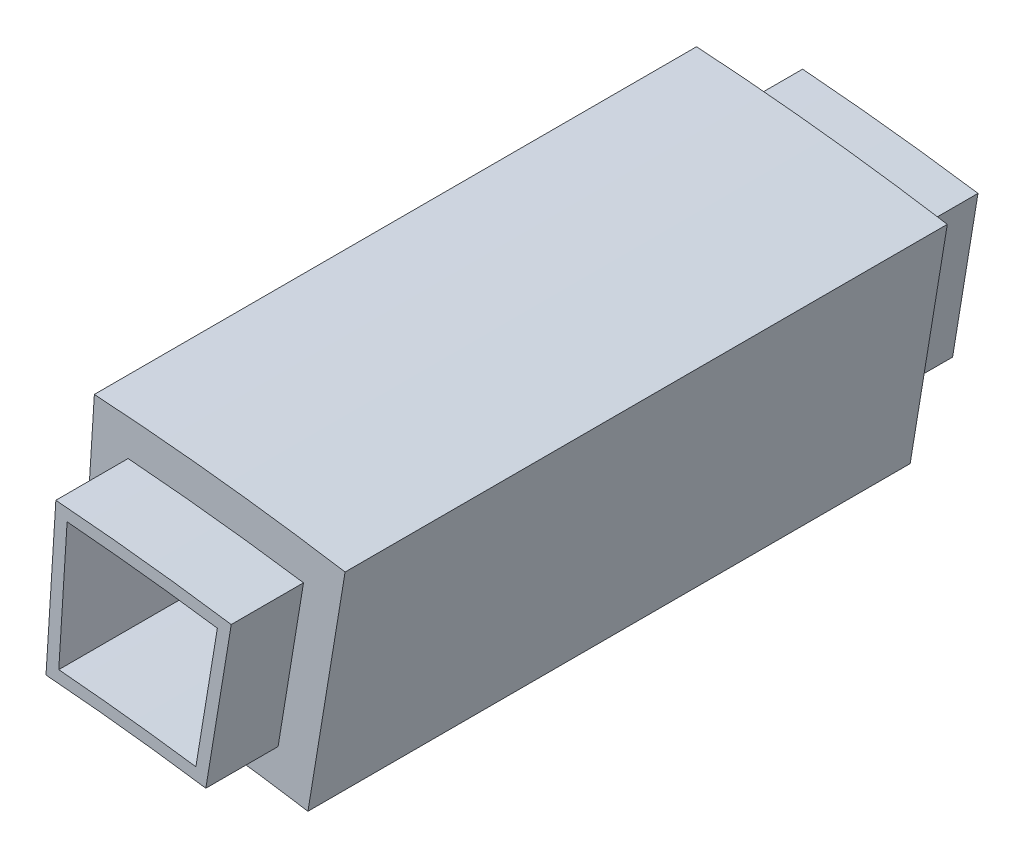
ISO-10303-21;
HEADER;
FILE_DESCRIPTION(('STEP AP214'),'2;1');
FILE_NAME('part.step','',(''),(''),'','','');
FILE_SCHEMA(('AUTOMOTIVE_DESIGN { 1 0 10303 214 1 1 1 1 }'));
ENDSEC;
DATA;
#1=APPLICATION_CONTEXT('core data for automotive mechanical design processes');
#2=APPLICATION_PROTOCOL_DEFINITION('international standard','automotive_design',2000,#1);
#3=PRODUCT_CONTEXT('',#1,'mechanical');
#4=PRODUCT('Part','Part','',(#3));
#5=PRODUCT_RELATED_PRODUCT_CATEGORY('part','',(#4));
#6=PRODUCT_DEFINITION_FORMATION('','',#4);
#7=PRODUCT_DEFINITION_CONTEXT('part definition',#1,'design');
#8=PRODUCT_DEFINITION('design','',#6,#7);
#9=PRODUCT_DEFINITION_SHAPE('','',#8);
#10=(LENGTH_UNIT() NAMED_UNIT(*) SI_UNIT(.MILLI.,.METRE.));
#11=(NAMED_UNIT(*) PLANE_ANGLE_UNIT() SI_UNIT($,.RADIAN.));
#12=(NAMED_UNIT(*) SI_UNIT($,.STERADIAN.) SOLID_ANGLE_UNIT());
#13=UNCERTAINTY_MEASURE_WITH_UNIT(LENGTH_MEASURE(1.E-05),#10,'distance_accuracy_value','');
#14=(GEOMETRIC_REPRESENTATION_CONTEXT(3) GLOBAL_UNCERTAINTY_ASSIGNED_CONTEXT((#13)) GLOBAL_UNIT_ASSIGNED_CONTEXT((#10,
#11,#12)) REPRESENTATION_CONTEXT('',''));
#15=CARTESIAN_POINT('',(0.,0.,0.));
#16=DIRECTION('',(0.,0.,1.));
#17=DIRECTION('',(1.,0.,0.));
#18=AXIS2_PLACEMENT_3D('',#15,#16,#17);
#19=CARTESIAN_POINT('',(-0.753677128188632,-6.1421444021572,-234.22247102965));
#20=DIRECTION('',(0.,0.,1.));
#21=DIRECTION('',(1.,0.,0.));
#22=AXIS2_PLACEMENT_3D('',#19,#20,#21);
#23=PLANE('',#22);
#24=CARTESIAN_POINT('',(-0.753677128188632,-6.1421444021572,-234.22247102965));
#25=DIRECTION('',(0.,0.,1.));
#26=DIRECTION('',(1.,0.,0.));
#27=AXIS2_PLACEMENT_3D('',#24,#25,#26);
#28=CIRCLE('',#27,101.75);
#29=CARTESIAN_POINT('',(7.3959409503177,95.2809605846972,-234.22247102965));
#30=VERTEX_POINT('',#29);
#31=CARTESIAN_POINT('',(14.0312230761671,94.527956551141,-234.22247102965));
#32=VERTEX_POINT('',#31);
#33=EDGE_CURVE('E227',#30,#32,#28,.F.);
#34=ORIENTED_EDGE('',*,*,#33,.F.);
#35=DIRECTION('',(-0.062938918020261,-0.998017380909991,0.));
#36=VECTOR('',#35,1.);
#37=CARTESIAN_POINT('',(0.992853288403506,-6.25228750869264,-234.22247102965));
#38=LINE('',#37,#36);
#39=CARTESIAN_POINT('',(7.80510080367252,101.768975600895,-234.22247102965));
#40=VERTEX_POINT('',#39);
#41=EDGE_CURVE('E210',#40,#30,#38,.T.);
#42=ORIENTED_EDGE('',*,*,#41,.F.);
#43=CARTESIAN_POINT('',(-0.753677128188632,-6.1421444021572,-234.22247102965));
#44=DIRECTION('',(0.,0.,1.));
#45=DIRECTION('',(1.,0.,0.));
#46=AXIS2_PLACEMENT_3D('',#43,#44,#45);
#47=CIRCLE('',#46,108.25);
#48=CARTESIAN_POINT('',(15.0863271224871,100.942666683909,-234.22247102965));
#49=VERTEX_POINT('',#48);
#50=EDGE_CURVE('E52',#49,#40,#47,.T.);
#51=ORIENTED_EDGE('',*,*,#50,.F.);
#52=DIRECTION('',(0.16230113128082,0.986741274491427,0.));
#53=VECTOR('',#52,1.);
#54=CARTESIAN_POINT('',(-2.48047435854879,-5.85811742241574,-234.22247102965));
#55=LINE('',#54,#53);
#56=EDGE_CURVE('E47',#32,#49,#55,.T.);
#57=ORIENTED_EDGE('',*,*,#56,.F.);
#58=EDGE_LOOP('',(#34,#42,#51,#57));
#59=FACE_BOUND('',#58,.T.);
#60=CARTESIAN_POINT('',(-0.753677128188632,-6.1421444021572,-234.22247102965));
#61=DIRECTION('',(0.,0.,1.));
#62=DIRECTION('',(1.,0.,0.));
#63=AXIS2_PLACEMENT_3D('',#60,#61,#62);
#64=CIRCLE('',#63,100.25);
#65=CARTESIAN_POINT('',(5.80543412917572,93.8930522014059,-234.22247102965));
#66=VERTEX_POINT('',#65);
#67=CARTESIAN_POINT('',(15.27027537139,92.8189360602713,-234.22247102965));
#68=VERTEX_POINT('',#67);
#69=EDGE_CURVE('E233',#66,#68,#64,.F.);
#70=ORIENTED_EDGE('',*,*,#69,.T.);
#71=DIRECTION('',(0.16230113128082,0.986741274491427,0.));
#72=VECTOR('',#71,1.);
#73=CARTESIAN_POINT('',(15.4313747241055,93.7983708883823,-234.22247102965));
#74=LINE('',#73,#72);
#75=CARTESIAN_POINT('',(16.8121404978923,102.193004792955,-234.22247102965));
#76=VERTEX_POINT('',#75);
#77=EDGE_CURVE('E236',#68,#76,#74,.T.);
#78=ORIENTED_EDGE('',*,*,#77,.T.);
#79=CARTESIAN_POINT('',(-0.753677128188632,-6.1421444021572,-234.22247102965));
#80=DIRECTION('',(0.,0.,1.));
#81=DIRECTION('',(1.,0.,0.));
#82=AXIS2_PLACEMENT_3D('',#79,#80,#81);
#83=CIRCLE('',#82,109.75);
#84=CARTESIAN_POINT('',(6.40335554863469,103.374244249327,-234.22247102965));
#85=VERTEX_POINT('',#84);
#86=EDGE_CURVE('E239',#76,#85,#83,.T.);
#87=ORIENTED_EDGE('',*,*,#86,.T.);
#88=DIRECTION('',(-0.0629389180202598,-0.998017380909992,0.));
#89=VECTOR('',#88,1.);
#90=CARTESIAN_POINT('',(6.33998238940716,102.369341140381,-234.22247102965));
#91=LINE('',#90,#89);
#92=EDGE_CURVE('E241',#85,#66,#91,.T.);
#93=ORIENTED_EDGE('',*,*,#92,.T.);
#94=EDGE_LOOP('',(#70,#78,#87,#93));
#95=FACE_BOUND('',#94,.T.);
#96=ADVANCED_FACE('F32',(#59,#95),#23,.T.);
#97=CARTESIAN_POINT('',(-0.753677128188632,-6.1421444021572,-259.22247102965));
#98=DIRECTION('',(0.,0.,1.));
#99=DIRECTION('',(1.,0.,0.));
#100=AXIS2_PLACEMENT_3D('',#97,#98,#99);
#101=PLANE('',#100);
#102=DIRECTION('',(-0.062938918020261,-0.998017380909991,0.));
#103=VECTOR('',#102,1.);
#104=CARTESIAN_POINT('',(0.992853288403506,-6.25228750869264,-259.22247102965));
#105=LINE('',#104,#103);
#106=CARTESIAN_POINT('',(7.80510080367251,101.768975600895,-259.22247102965));
#107=VERTEX_POINT('',#106);
#108=CARTESIAN_POINT('',(7.3959409503177,95.2809605846972,-259.22247102965));
#109=VERTEX_POINT('',#108);
#110=EDGE_CURVE('E262',#107,#109,#105,.T.);
#111=ORIENTED_EDGE('',*,*,#110,.T.);
#112=CARTESIAN_POINT('',(-0.753677128188632,-6.1421444021572,-259.22247102965));
#113=DIRECTION('',(0.,0.,1.));
#114=DIRECTION('',(1.,0.,0.));
#115=AXIS2_PLACEMENT_3D('',#112,#113,#114);
#116=CIRCLE('',#115,101.75);
#117=CARTESIAN_POINT('',(14.0312230761671,94.527956551141,-259.22247102965));
#118=VERTEX_POINT('',#117);
#119=EDGE_CURVE('E11',#109,#118,#116,.F.);
#120=ORIENTED_EDGE('',*,*,#119,.T.);
#121=DIRECTION('',(0.16230113128082,0.986741274491427,0.));
#122=VECTOR('',#121,1.);
#123=CARTESIAN_POINT('',(-2.48047435854879,-5.85811742241574,-259.22247102965));
#124=LINE('',#123,#122);
#125=CARTESIAN_POINT('',(15.0863271224871,100.942666683909,-259.22247102965));
#126=VERTEX_POINT('',#125);
#127=EDGE_CURVE('E40',#118,#126,#124,.T.);
#128=ORIENTED_EDGE('',*,*,#127,.T.);
#129=CARTESIAN_POINT('',(-0.753677128188632,-6.1421444021572,-259.22247102965));
#130=DIRECTION('',(0.,0.,1.));
#131=DIRECTION('',(1.,0.,0.));
#132=AXIS2_PLACEMENT_3D('',#129,#130,#131);
#133=CIRCLE('',#132,108.25);
#134=EDGE_CURVE('E265',#126,#107,#133,.T.);
#135=ORIENTED_EDGE('',*,*,#134,.T.);
#136=EDGE_LOOP('',(#111,#120,#128,#135));
#137=FACE_BOUND('',#136,.T.);
#138=CARTESIAN_POINT('',(-0.753677128188632,-6.1421444021572,-259.22247102965));
#139=DIRECTION('',(0.,0.,1.));
#140=DIRECTION('',(1.,0.,0.));
#141=AXIS2_PLACEMENT_3D('',#138,#139,#140);
#142=CIRCLE('',#141,100.25);
#143=CARTESIAN_POINT('',(5.80543412917572,93.8930522014059,-259.22247102965));
#144=VERTEX_POINT('',#143);
#145=CARTESIAN_POINT('',(15.27027537139,92.8189360602713,-259.22247102965));
#146=VERTEX_POINT('',#145);
#147=EDGE_CURVE('E154',#144,#146,#142,.F.);
#148=ORIENTED_EDGE('',*,*,#147,.F.);
#149=DIRECTION('',(-0.0629389180202598,-0.998017380909992,0.));
#150=VECTOR('',#149,1.);
#151=CARTESIAN_POINT('',(6.33998238940716,102.369341140381,-259.22247102965));
#152=LINE('',#151,#150);
#153=CARTESIAN_POINT('',(6.40335554863469,103.374244249327,-259.22247102965));
#154=VERTEX_POINT('',#153);
#155=EDGE_CURVE('E237',#154,#144,#152,.T.);
#156=ORIENTED_EDGE('',*,*,#155,.F.);
#157=CARTESIAN_POINT('',(-0.753677128188632,-6.1421444021572,-259.22247102965));
#158=DIRECTION('',(0.,0.,1.));
#159=DIRECTION('',(1.,0.,0.));
#160=AXIS2_PLACEMENT_3D('',#157,#158,#159);
#161=CIRCLE('',#160,109.75);
#162=CARTESIAN_POINT('',(16.8121404978923,102.193004792955,-259.22247102965));
#163=VERTEX_POINT('',#162);
#164=EDGE_CURVE('E248',#163,#154,#161,.T.);
#165=ORIENTED_EDGE('',*,*,#164,.F.);
#166=DIRECTION('',(0.16230113128082,0.986741274491427,0.));
#167=VECTOR('',#166,1.);
#168=CARTESIAN_POINT('',(15.4313747241055,93.7983708883823,-259.22247102965));
#169=LINE('',#168,#167);
#170=EDGE_CURVE('E246',#146,#163,#169,.T.);
#171=ORIENTED_EDGE('',*,*,#170,.F.);
#172=EDGE_LOOP('',(#148,#156,#165,#171));
#173=FACE_BOUND('',#172,.T.);
#174=ADVANCED_FACE('F269',(#137,#173),#101,.F.);
#175=CARTESIAN_POINT('',(-0.753677128188632,-6.1421444021572,-234.22247102965));
#176=DIRECTION('',(0.,0.,-1.));
#177=DIRECTION('',(-1.,0.,0.));
#178=AXIS2_PLACEMENT_3D('',#175,#176,#177);
#179=CYLINDRICAL_SURFACE('',#178,100.25);
#180=ORIENTED_EDGE('',*,*,#147,.T.);
#181=DIRECTION('',(0.,0.,-1.));
#182=VECTOR('',#181,1.);
#183=CARTESIAN_POINT('',(15.27027537139,92.8189360602713,-234.22247102965));
#184=LINE('',#183,#182);
#185=EDGE_CURVE('E259',#68,#146,#184,.T.);
#186=ORIENTED_EDGE('',*,*,#185,.F.);
#187=ORIENTED_EDGE('',*,*,#69,.F.);
#188=DIRECTION('',(0.,0.,-1.));
#189=VECTOR('',#188,1.);
#190=CARTESIAN_POINT('',(5.80543412917572,93.8930522014059,-234.22247102965));
#191=LINE('',#190,#189);
#192=EDGE_CURVE('E243',#66,#144,#191,.T.);
#193=ORIENTED_EDGE('',*,*,#192,.T.);
#194=EDGE_LOOP('',(#180,#186,#187,#193));
#195=FACE_BOUND('',#194,.T.);
#196=ADVANCED_FACE('F34',(#195),#179,.F.);
#197=CARTESIAN_POINT('',(15.4313747241055,93.7983708883823,-234.22247102965));
#198=DIRECTION('',(-0.986741274491427,0.16230113128082,0.));
#199=DIRECTION('',(-0.16230113128082,-0.986741274491427,0.));
#200=AXIS2_PLACEMENT_3D('',#197,#198,#199);
#201=PLANE('',#200);
#202=ORIENTED_EDGE('',*,*,#170,.T.);
#203=DIRECTION('',(0.,0.,-1.));
#204=VECTOR('',#203,1.);
#205=CARTESIAN_POINT('',(16.8121404978923,102.193004792955,-234.22247102965));
#206=LINE('',#205,#204);
#207=EDGE_CURVE('E256',#76,#163,#206,.T.);
#208=ORIENTED_EDGE('',*,*,#207,.F.);
#209=ORIENTED_EDGE('',*,*,#77,.F.);
#210=ORIENTED_EDGE('',*,*,#185,.T.);
#211=EDGE_LOOP('',(#202,#208,#209,#210));
#212=FACE_BOUND('',#211,.T.);
#213=ADVANCED_FACE('F316',(#212),#201,.F.);
#214=CARTESIAN_POINT('',(-0.753677128188632,-6.1421444021572,-234.22247102965));
#215=DIRECTION('',(0.,0.,-1.));
#216=DIRECTION('',(-1.,0.,0.));
#217=AXIS2_PLACEMENT_3D('',#214,#215,#216);
#218=CYLINDRICAL_SURFACE('',#217,109.75);
#219=ORIENTED_EDGE('',*,*,#164,.T.);
#220=DIRECTION('',(0.,0.,-1.));
#221=VECTOR('',#220,1.);
#222=CARTESIAN_POINT('',(6.40335554863469,103.374244249327,-234.22247102965));
#223=LINE('',#222,#221);
#224=EDGE_CURVE('E253',#85,#154,#223,.T.);
#225=ORIENTED_EDGE('',*,*,#224,.F.);
#226=ORIENTED_EDGE('',*,*,#86,.F.);
#227=ORIENTED_EDGE('',*,*,#207,.T.);
#228=EDGE_LOOP('',(#219,#225,#226,#227));
#229=FACE_BOUND('',#228,.T.);
#230=ADVANCED_FACE('F298',(#229),#218,.T.);
#231=CARTESIAN_POINT('',(6.33998238940716,102.369341140381,-234.22247102965));
#232=DIRECTION('',(0.998017380909991,-0.0629389180202598,0.));
#233=DIRECTION('',(0.0629389180202598,0.998017380909992,0.));
#234=AXIS2_PLACEMENT_3D('',#231,#232,#233);
#235=PLANE('',#234);
#236=ORIENTED_EDGE('',*,*,#155,.T.);
#237=ORIENTED_EDGE('',*,*,#192,.F.);
#238=ORIENTED_EDGE('',*,*,#92,.F.);
#239=ORIENTED_EDGE('',*,*,#224,.T.);
#240=EDGE_LOOP('',(#236,#237,#238,#239));
#241=FACE_BOUND('',#240,.T.);
#242=ADVANCED_FACE('F289',(#241),#235,.F.);
#243=CARTESIAN_POINT('',(7.3959409503177,95.2809605846972,-231.22247102965));
#244=DIRECTION('',(-0.998017380909991,0.062938918020261,0.));
#245=DIRECTION('',(-0.062938918020261,-0.998017380909991,0.));
#246=AXIS2_PLACEMENT_3D('',#243,#244,#245);
#247=PLANE('',#246);
#248=ORIENTED_EDGE('',*,*,#110,.F.);
#249=DIRECTION('',(0.,0.,-1.));
#250=VECTOR('',#249,1.);
#251=CARTESIAN_POINT('',(7.80510080367251,101.768975600895,-231.22247102965));
#252=LINE('',#251,#250);
#253=CARTESIAN_POINT('',(7.80510080367251,101.768975600895,-262.22247102965));
#254=VERTEX_POINT('',#253);
#255=EDGE_CURVE('E219',#107,#254,#252,.T.);
#256=ORIENTED_EDGE('',*,*,#255,.T.);
#257=DIRECTION('',(0.062938918020261,0.998017380909991,0.));
#258=VECTOR('',#257,1.);
#259=CARTESIAN_POINT('',(7.3959409503177,95.2809605846972,-262.22247102965));
#260=LINE('',#259,#258);
#261=CARTESIAN_POINT('',(7.3959409503177,95.2809605846972,-262.22247102965));
#262=VERTEX_POINT('',#261);
#263=EDGE_CURVE('E176',#262,#254,#260,.T.);
#264=ORIENTED_EDGE('',*,*,#263,.F.);
#265=DIRECTION('',(0.,0.,-1.));
#266=VECTOR('',#265,1.);
#267=CARTESIAN_POINT('',(7.3959409503177,95.2809605846972,-231.22247102965));
#268=LINE('',#267,#266);
#269=EDGE_CURVE('E206',#109,#262,#268,.T.);
#270=ORIENTED_EDGE('',*,*,#269,.F.);
#271=EDGE_LOOP('',(#248,#256,#264,#270));
#272=FACE_BOUND('',#271,.T.);
#273=ADVANCED_FACE('F287',(#272),#247,.T.);
#274=CARTESIAN_POINT('',(-0.753677128188632,-6.1421444021572,-231.22247102965));
#275=DIRECTION('',(0.,0.,-1.));
#276=DIRECTION('',(-1.,0.,0.));
#277=AXIS2_PLACEMENT_3D('',#274,#275,#276);
#278=CYLINDRICAL_SURFACE('',#277,108.25);
#279=ORIENTED_EDGE('',*,*,#134,.F.);
#280=DIRECTION('',(0.,0.,-1.));
#281=VECTOR('',#280,1.);
#282=CARTESIAN_POINT('',(15.0863271224871,100.942666683909,-231.22247102965));
#283=LINE('',#282,#281);
#284=CARTESIAN_POINT('',(15.0863271224871,100.942666683909,-262.22247102965));
#285=VERTEX_POINT('',#284);
#286=EDGE_CURVE('E215',#126,#285,#283,.T.);
#287=ORIENTED_EDGE('',*,*,#286,.T.);
#288=CARTESIAN_POINT('',(-0.753677128188632,-6.1421444021572,-262.22247102965));
#289=DIRECTION('',(0.,0.,-1.));
#290=DIRECTION('',(-1.,0.,0.));
#291=AXIS2_PLACEMENT_3D('',#288,#289,#290);
#292=CIRCLE('',#291,108.25);
#293=EDGE_CURVE('E179',#254,#285,#292,.T.);
#294=ORIENTED_EDGE('',*,*,#293,.F.);
#295=ORIENTED_EDGE('',*,*,#255,.F.);
#296=EDGE_LOOP('',(#279,#287,#294,#295));
#297=FACE_BOUND('',#296,.T.);
#298=ADVANCED_FACE('F285',(#297),#278,.T.);
#299=CARTESIAN_POINT('',(15.0863271224871,100.942666683909,-231.22247102965));
#300=DIRECTION('',(0.986741274491427,-0.16230113128082,0.));
#301=DIRECTION('',(0.16230113128082,0.986741274491427,0.));
#302=AXIS2_PLACEMENT_3D('',#299,#300,#301);
#303=PLANE('',#302);
#304=ORIENTED_EDGE('',*,*,#127,.F.);
#305=DIRECTION('',(0.,0.,-1.));
#306=VECTOR('',#305,1.);
#307=CARTESIAN_POINT('',(14.0312230761671,94.527956551141,-231.22247102965));
#308=LINE('',#307,#306);
#309=CARTESIAN_POINT('',(14.0312230761671,94.527956551141,-262.22247102965));
#310=VERTEX_POINT('',#309);
#311=EDGE_CURVE('E211',#118,#310,#308,.T.);
#312=ORIENTED_EDGE('',*,*,#311,.T.);
#313=DIRECTION('',(-0.16230113128082,-0.986741274491427,0.));
#314=VECTOR('',#313,1.);
#315=CARTESIAN_POINT('',(15.0863271224871,100.942666683909,-262.22247102965));
#316=LINE('',#315,#314);
#317=EDGE_CURVE('E182',#285,#310,#316,.T.);
#318=ORIENTED_EDGE('',*,*,#317,.F.);
#319=ORIENTED_EDGE('',*,*,#286,.F.);
#320=EDGE_LOOP('',(#304,#312,#318,#319));
#321=FACE_BOUND('',#320,.T.);
#322=ADVANCED_FACE('F275',(#321),#303,.T.);
#323=CARTESIAN_POINT('',(-0.753677128188632,-6.1421444021572,-231.22247102965));
#324=DIRECTION('',(0.,0.,-1.));
#325=DIRECTION('',(-1.,0.,0.));
#326=AXIS2_PLACEMENT_3D('',#323,#324,#325);
#327=CYLINDRICAL_SURFACE('',#326,101.75);
#328=ORIENTED_EDGE('',*,*,#119,.F.);
#329=ORIENTED_EDGE('',*,*,#269,.T.);
#330=CARTESIAN_POINT('',(-0.753677128188632,-6.1421444021572,-262.22247102965));
#331=DIRECTION('',(0.,0.,1.));
#332=DIRECTION('',(-1.,0.,0.));
#333=AXIS2_PLACEMENT_3D('',#330,#331,#332);
#334=CIRCLE('',#333,101.75);
#335=EDGE_CURVE('E173',#310,#262,#334,.T.);
#336=ORIENTED_EDGE('',*,*,#335,.F.);
#337=ORIENTED_EDGE('',*,*,#311,.F.);
#338=EDGE_LOOP('',(#328,#329,#336,#337));
#339=FACE_BOUND('',#338,.T.);
#340=ADVANCED_FACE('F279',(#339),#327,.F.);
#341=CARTESIAN_POINT('',(-0.753677128188632,-6.1421444021572,-262.22247102965));
#342=DIRECTION('',(0.,0.,-1.));
#343=DIRECTION('',(-1.,0.,0.));
#344=AXIS2_PLACEMENT_3D('',#341,#342,#343);
#345=PLANE('',#344);
#346=ORIENTED_EDGE('',*,*,#335,.T.);
#347=ORIENTED_EDGE('',*,*,#263,.T.);
#348=ORIENTED_EDGE('',*,*,#293,.T.);
#349=ORIENTED_EDGE('',*,*,#317,.T.);
#350=EDGE_LOOP('',(#346,#347,#348,#349));
#351=FACE_BOUND('',#350,.T.);
#352=DIRECTION('',(0.0629389180202611,0.998017380909991,0.));
#353=VECTOR('',#352,1.);
#354=CARTESIAN_POINT('',(7.92580807331049,95.7388108183204,-262.22247102965));
#355=LINE('',#354,#353);
#356=CARTESIAN_POINT('',(7.92580807331049,95.7388108183204,-262.22247102965));
#357=VERTEX_POINT('',#356);
#358=CARTESIAN_POINT('',(8.27205168085925,101.229167965093,-262.22247102965));
#359=VERTEX_POINT('',#358);
#360=EDGE_CURVE('E147',#357,#359,#355,.T.);
#361=ORIENTED_EDGE('',*,*,#360,.F.);
#362=CARTESIAN_POINT('',(-0.753677128188632,-6.1421444021572,-262.22247102965));
#363=DIRECTION('',(0.,0.,1.));
#364=DIRECTION('',(-1.,0.,0.));
#365=AXIS2_PLACEMENT_3D('',#362,#363,#364);
#366=CIRCLE('',#365,102.25);
#367=CARTESIAN_POINT('',(13.6174273453223,95.0928982274157,-262.22247102965));
#368=VERTEX_POINT('',#367);
#369=EDGE_CURVE('E158',#368,#357,#366,.T.);
#370=ORIENTED_EDGE('',*,*,#369,.F.);
#371=DIRECTION('',(-0.16230113128082,-0.986741274491427,0.));
#372=VECTOR('',#371,1.);
#373=CARTESIAN_POINT('',(14.510288725396,100.521222535234,-262.22247102965));
#374=LINE('',#373,#372);
#375=CARTESIAN_POINT('',(14.510288725396,100.521222535234,-262.22247102965));
#376=VERTEX_POINT('',#375);
#377=EDGE_CURVE('E169',#376,#368,#374,.T.);
#378=ORIENTED_EDGE('',*,*,#377,.F.);
#379=CARTESIAN_POINT('',(-0.753677128188632,-6.1421444021572,-262.22247102965));
#380=DIRECTION('',(0.,0.,-1.));
#381=DIRECTION('',(-1.,0.,0.));
#382=AXIS2_PLACEMENT_3D('',#379,#380,#381);
#383=CIRCLE('',#382,107.75);
#384=EDGE_CURVE('E167',#359,#376,#383,.T.);
#385=ORIENTED_EDGE('',*,*,#384,.F.);
#386=EDGE_LOOP('',(#361,#370,#378,#385));
#387=FACE_BOUND('',#386,.T.);
#388=ADVANCED_FACE('F165',(#351,#387),#345,.T.);
#389=CARTESIAN_POINT('',(7.3959409503177,95.2809605846972,-231.22247102965));
#390=VERTEX_POINT('',#389);
#391=EDGE_CURVE('E220',#390,#30,#268,.T.);
#392=ORIENTED_EDGE('',*,*,#391,.T.);
#393=ORIENTED_EDGE('',*,*,#33,.T.);
#394=CARTESIAN_POINT('',(14.0312230761671,94.527956551141,-231.22247102965));
#395=VERTEX_POINT('',#394);
#396=EDGE_CURVE('E207',#395,#32,#308,.T.);
#397=ORIENTED_EDGE('',*,*,#396,.F.);
#398=CARTESIAN_POINT('',(-0.753677128188632,-6.1421444021572,-231.22247102965));
#399=DIRECTION('',(0.,0.,1.));
#400=DIRECTION('',(-1.,0.,0.));
#401=AXIS2_PLACEMENT_3D('',#398,#399,#400);
#402=CIRCLE('',#401,101.75);
#403=EDGE_CURVE('E194',#395,#390,#402,.T.);
#404=ORIENTED_EDGE('',*,*,#403,.T.);
#405=EDGE_LOOP('',(#392,#393,#397,#404));
#406=FACE_BOUND('',#405,.T.);
#407=ADVANCED_FACE('F395',(#406),#327,.F.);
#408=ORIENTED_EDGE('',*,*,#396,.T.);
#409=ORIENTED_EDGE('',*,*,#56,.T.);
#410=CARTESIAN_POINT('',(15.0863271224871,100.942666683909,-231.22247102965));
#411=VERTEX_POINT('',#410);
#412=EDGE_CURVE('E212',#411,#49,#283,.T.);
#413=ORIENTED_EDGE('',*,*,#412,.F.);
#414=DIRECTION('',(-0.16230113128082,-0.986741274491427,0.));
#415=VECTOR('',#414,1.);
#416=CARTESIAN_POINT('',(15.0863271224871,100.942666683909,-231.22247102965));
#417=LINE('',#416,#415);
#418=EDGE_CURVE('E203',#411,#395,#417,.T.);
#419=ORIENTED_EDGE('',*,*,#418,.T.);
#420=EDGE_LOOP('',(#408,#409,#413,#419));
#421=FACE_BOUND('',#420,.T.);
#422=ADVANCED_FACE('F386',(#421),#303,.T.);
#423=ORIENTED_EDGE('',*,*,#412,.T.);
#424=ORIENTED_EDGE('',*,*,#50,.T.);
#425=CARTESIAN_POINT('',(7.80510080367251,101.768975600895,-231.22247102965));
#426=VERTEX_POINT('',#425);
#427=EDGE_CURVE('E216',#426,#40,#252,.T.);
#428=ORIENTED_EDGE('',*,*,#427,.F.);
#429=CARTESIAN_POINT('',(-0.753677128188632,-6.1421444021572,-231.22247102965));
#430=DIRECTION('',(0.,0.,-1.));
#431=DIRECTION('',(-1.,0.,0.));
#432=AXIS2_PLACEMENT_3D('',#429,#430,#431);
#433=CIRCLE('',#432,108.25);
#434=EDGE_CURVE('E200',#426,#411,#433,.T.);
#435=ORIENTED_EDGE('',*,*,#434,.T.);
#436=EDGE_LOOP('',(#423,#424,#428,#435));
#437=FACE_BOUND('',#436,.T.);
#438=ADVANCED_FACE('F297',(#437),#278,.T.);
#439=ORIENTED_EDGE('',*,*,#427,.T.);
#440=ORIENTED_EDGE('',*,*,#41,.T.);
#441=ORIENTED_EDGE('',*,*,#391,.F.);
#442=DIRECTION('',(0.062938918020261,0.998017380909991,0.));
#443=VECTOR('',#442,1.);
#444=CARTESIAN_POINT('',(7.3959409503177,95.2809605846972,-231.22247102965));
#445=LINE('',#444,#443);
#446=EDGE_CURVE('E197',#390,#426,#445,.T.);
#447=ORIENTED_EDGE('',*,*,#446,.T.);
#448=EDGE_LOOP('',(#439,#440,#441,#447));
#449=FACE_BOUND('',#448,.T.);
#450=ADVANCED_FACE('F291',(#449),#247,.T.);
#451=CARTESIAN_POINT('',(-0.753677128188632,-6.1421444021572,-231.22247102965));
#452=DIRECTION('',(0.,0.,-1.));
#453=DIRECTION('',(-1.,0.,0.));
#454=AXIS2_PLACEMENT_3D('',#451,#452,#453);
#455=PLANE('',#454);
#456=DIRECTION('',(-0.16230113128082,-0.986741274491427,0.));
#457=VECTOR('',#456,1.);
#458=CARTESIAN_POINT('',(14.510288725396,100.521222535234,-231.22247102965));
#459=LINE('',#458,#457);
#460=CARTESIAN_POINT('',(14.510288725396,100.521222535234,-231.22247102965));
#461=VERTEX_POINT('',#460);
#462=CARTESIAN_POINT('',(13.6174273453223,95.0928982274157,-231.22247102965));
#463=VERTEX_POINT('',#462);
#464=EDGE_CURVE('E191',#461,#463,#459,.T.);
#465=ORIENTED_EDGE('',*,*,#464,.T.);
#466=CARTESIAN_POINT('',(-0.753677128188632,-6.1421444021572,-231.22247102965));
#467=DIRECTION('',(0.,0.,1.));
#468=DIRECTION('',(-1.,0.,0.));
#469=AXIS2_PLACEMENT_3D('',#466,#467,#468);
#470=CIRCLE('',#469,102.25);
#471=CARTESIAN_POINT('',(7.92580807331049,95.7388108183204,-231.22247102965));
#472=VERTEX_POINT('',#471);
#473=EDGE_CURVE('E185',#463,#472,#470,.T.);
#474=ORIENTED_EDGE('',*,*,#473,.T.);
#475=DIRECTION('',(0.0629389180202611,0.998017380909991,0.));
#476=VECTOR('',#475,1.);
#477=CARTESIAN_POINT('',(7.92580807331049,95.7388108183204,-231.22247102965));
#478=LINE('',#477,#476);
#479=CARTESIAN_POINT('',(8.27205168085925,101.229167965093,-231.22247102965));
#480=VERTEX_POINT('',#479);
#481=EDGE_CURVE('E150',#472,#480,#478,.T.);
#482=ORIENTED_EDGE('',*,*,#481,.T.);
#483=CARTESIAN_POINT('',(-0.753677128188632,-6.1421444021572,-231.22247102965));
#484=DIRECTION('',(0.,0.,-1.));
#485=DIRECTION('',(-1.,0.,0.));
#486=AXIS2_PLACEMENT_3D('',#483,#484,#485);
#487=CIRCLE('',#486,107.75);
#488=EDGE_CURVE('E188',#480,#461,#487,.T.);
#489=ORIENTED_EDGE('',*,*,#488,.T.);
#490=EDGE_LOOP('',(#465,#474,#482,#489));
#491=FACE_BOUND('',#490,.T.);
#492=ORIENTED_EDGE('',*,*,#403,.F.);
#493=ORIENTED_EDGE('',*,*,#418,.F.);
#494=ORIENTED_EDGE('',*,*,#434,.F.);
#495=ORIENTED_EDGE('',*,*,#446,.F.);
#496=EDGE_LOOP('',(#492,#493,#494,#495));
#497=FACE_BOUND('',#496,.T.);
#498=ADVANCED_FACE('F303',(#491,#497),#455,.F.);
#499=CARTESIAN_POINT('',(7.92580807331049,95.7388108183204,-222.097217333172));
#500=DIRECTION('',(-0.998017380909991,0.0629389180202611,0.));
#501=DIRECTION('',(-0.0629389180202611,-0.998017380909991,0.));
#502=AXIS2_PLACEMENT_3D('',#499,#500,#501);
#503=PLANE('',#502);
#504=DIRECTION('',(0.,0.,-1.));
#505=VECTOR('',#504,1.);
#506=CARTESIAN_POINT('',(8.27205168085925,101.229167965093,-222.097217333172));
#507=LINE('',#506,#505);
#508=EDGE_CURVE('E155',#480,#359,#507,.T.);
#509=ORIENTED_EDGE('',*,*,#508,.F.);
#510=ORIENTED_EDGE('',*,*,#481,.F.);
#511=DIRECTION('',(0.,0.,-1.));
#512=VECTOR('',#511,1.);
#513=CARTESIAN_POINT('',(7.92580807331049,95.7388108183204,-222.097217333172));
#514=LINE('',#513,#512);
#515=EDGE_CURVE('E143',#472,#357,#514,.T.);
#516=ORIENTED_EDGE('',*,*,#515,.T.);
#517=ORIENTED_EDGE('',*,*,#360,.T.);
#518=EDGE_LOOP('',(#509,#510,#516,#517));
#519=FACE_BOUND('',#518,.T.);
#520=ADVANCED_FACE('F145',(#519),#503,.F.);
#521=CARTESIAN_POINT('',(-0.753677128188632,-6.1421444021572,-222.097217333172));
#522=DIRECTION('',(0.,0.,-1.));
#523=DIRECTION('',(-1.,0.,0.));
#524=AXIS2_PLACEMENT_3D('',#521,#522,#523);
#525=CYLINDRICAL_SURFACE('',#524,107.75);
#526=DIRECTION('',(0.,0.,-1.));
#527=VECTOR('',#526,1.);
#528=CARTESIAN_POINT('',(14.510288725396,100.521222535234,-222.097217333172));
#529=LINE('',#528,#527);
#530=EDGE_CURVE('E230',#461,#376,#529,.T.);
#531=ORIENTED_EDGE('',*,*,#530,.F.);
#532=ORIENTED_EDGE('',*,*,#488,.F.);
#533=ORIENTED_EDGE('',*,*,#508,.T.);
#534=ORIENTED_EDGE('',*,*,#384,.T.);
#535=EDGE_LOOP('',(#531,#532,#533,#534));
#536=FACE_BOUND('',#535,.T.);
#537=ADVANCED_FACE('F441',(#536),#525,.F.);
#538=CARTESIAN_POINT('',(14.510288725396,100.521222535234,-222.097217333172));
#539=DIRECTION('',(0.986741274491427,-0.16230113128082,0.));
#540=DIRECTION('',(0.16230113128082,0.986741274491427,0.));
#541=AXIS2_PLACEMENT_3D('',#538,#539,#540);
#542=PLANE('',#541);
#543=DIRECTION('',(0.,0.,-1.));
#544=VECTOR('',#543,1.);
#545=CARTESIAN_POINT('',(13.6174273453223,95.0928982274157,-222.097217333172));
#546=LINE('',#545,#544);
#547=EDGE_CURVE('E160',#463,#368,#546,.T.);
#548=ORIENTED_EDGE('',*,*,#547,.F.);
#549=ORIENTED_EDGE('',*,*,#464,.F.);
#550=ORIENTED_EDGE('',*,*,#530,.T.);
#551=ORIENTED_EDGE('',*,*,#377,.T.);
#552=EDGE_LOOP('',(#548,#549,#550,#551));
#553=FACE_BOUND('',#552,.T.);
#554=ADVANCED_FACE('F449',(#553),#542,.F.);
#555=CARTESIAN_POINT('',(-0.753677128188632,-6.1421444021572,-222.097217333172));
#556=DIRECTION('',(0.,0.,-1.));
#557=DIRECTION('',(-1.,0.,0.));
#558=AXIS2_PLACEMENT_3D('',#555,#556,#557);
#559=CYLINDRICAL_SURFACE('',#558,102.25);
#560=ORIENTED_EDGE('',*,*,#515,.F.);
#561=ORIENTED_EDGE('',*,*,#473,.F.);
#562=ORIENTED_EDGE('',*,*,#547,.T.);
#563=ORIENTED_EDGE('',*,*,#369,.T.);
#564=EDGE_LOOP('',(#560,#561,#562,#563));
#565=FACE_BOUND('',#564,.T.);
#566=ADVANCED_FACE('F159',(#565),#559,.T.);
#567=CLOSED_SHELL('',(#96,#174,#196,#213,#230,#242,#273,#298,#322,#340,#388,#407,#422,#438,#450,
#498,#520,#537,#554,#566));
#568=MANIFOLD_SOLID_BREP('B2',#567);
#569=ADVANCED_BREP_SHAPE_REPRESENTATION('',(#18,#568),#14);
#570=SHAPE_DEFINITION_REPRESENTATION(#9,#569);
ENDSEC;
END-ISO-10303-21;
